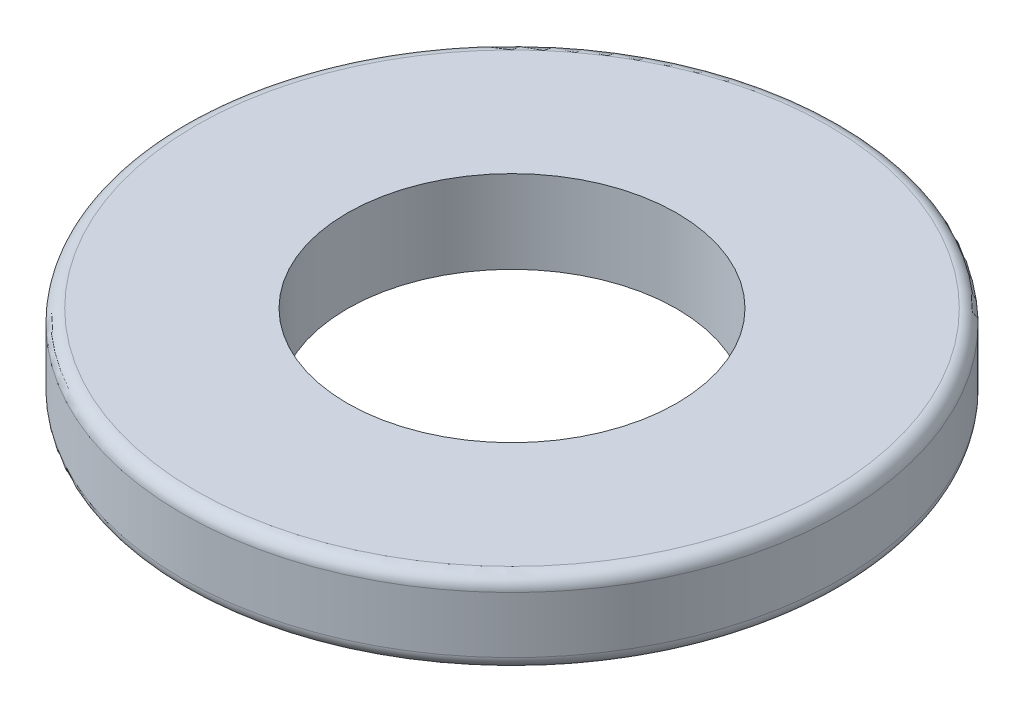
ISO-10303-21;
HEADER;
FILE_DESCRIPTION(('STEP AP214'),'2;1');
FILE_NAME('part.step','',(''),(''),'','','');
FILE_SCHEMA(('AUTOMOTIVE_DESIGN { 1 0 10303 214 1 1 1 1 }'));
ENDSEC;
DATA;
#1=APPLICATION_CONTEXT('core data for automotive mechanical design processes');
#2=APPLICATION_PROTOCOL_DEFINITION('international standard','automotive_design',2000,#1);
#3=PRODUCT_CONTEXT('',#1,'mechanical');
#4=PRODUCT('Part','Part','',(#3));
#5=PRODUCT_RELATED_PRODUCT_CATEGORY('part','',(#4));
#6=PRODUCT_DEFINITION_FORMATION('','',#4);
#7=PRODUCT_DEFINITION_CONTEXT('part definition',#1,'design');
#8=PRODUCT_DEFINITION('design','',#6,#7);
#9=PRODUCT_DEFINITION_SHAPE('','',#8);
#10=(LENGTH_UNIT() NAMED_UNIT(*) SI_UNIT(.MILLI.,.METRE.));
#11=(NAMED_UNIT(*) PLANE_ANGLE_UNIT() SI_UNIT($,.RADIAN.));
#12=(NAMED_UNIT(*) SI_UNIT($,.STERADIAN.) SOLID_ANGLE_UNIT());
#13=UNCERTAINTY_MEASURE_WITH_UNIT(LENGTH_MEASURE(1.E-05),#10,'distance_accuracy_value','');
#14=(GEOMETRIC_REPRESENTATION_CONTEXT(3) GLOBAL_UNCERTAINTY_ASSIGNED_CONTEXT((#13)) GLOBAL_UNIT_ASSIGNED_CONTEXT((#10,
#11,#12)) REPRESENTATION_CONTEXT('',''));
#15=CARTESIAN_POINT('',(0.,0.,0.));
#16=DIRECTION('',(0.,0.,1.));
#17=DIRECTION('',(1.,0.,0.));
#18=AXIS2_PLACEMENT_3D('',#15,#16,#17);
#19=CARTESIAN_POINT('',(0.,1.5875,0.));
#20=DIRECTION('',(0.,1.,0.));
#21=DIRECTION('',(0.,0.,1.));
#22=AXIS2_PLACEMENT_3D('',#19,#20,#21);
#23=PLANE('',#22);
#24=CARTESIAN_POINT('',(0.,1.5875,0.));
#25=DIRECTION('',(0.,1.,0.));
#26=DIRECTION('',(0.,0.,1.));
#27=AXIS2_PLACEMENT_3D('',#24,#25,#26);
#28=CIRCLE('',#27,6.0579);
#29=CARTESIAN_POINT('',(0.,1.5875,6.0579));
#30=VERTEX_POINT('',#29);
#31=EDGE_CURVE('E10',#30,#30,#28,.T.);
#32=ORIENTED_EDGE('',*,*,#31,.T.);
#33=EDGE_LOOP('',(#32));
#34=FACE_BOUND('',#33,.T.);
#35=CARTESIAN_POINT('',(0.,1.5875,0.));
#36=DIRECTION('',(0.,1.,0.));
#37=DIRECTION('',(0.,0.,1.));
#38=AXIS2_PLACEMENT_3D('',#35,#36,#37);
#39=CIRCLE('',#38,3.15595);
#40=CARTESIAN_POINT('',(0.,1.5875,3.15595));
#41=VERTEX_POINT('',#40);
#42=EDGE_CURVE('E61',#41,#41,#39,.T.);
#43=ORIENTED_EDGE('',*,*,#42,.F.);
#44=EDGE_LOOP('',(#43));
#45=FACE_BOUND('',#44,.T.);
#46=ADVANCED_FACE('F37',(#34,#45),#23,.T.);
#47=CARTESIAN_POINT('',(0.,0.,0.));
#48=DIRECTION('',(0.,1.,0.));
#49=DIRECTION('',(0.,0.,1.));
#50=AXIS2_PLACEMENT_3D('',#47,#48,#49);
#51=PLANE('',#50);
#52=CARTESIAN_POINT('',(0.,0.,0.));
#53=DIRECTION('',(0.,1.,0.));
#54=DIRECTION('',(0.,0.,1.));
#55=AXIS2_PLACEMENT_3D('',#52,#53,#54);
#56=CIRCLE('',#55,6.0579);
#57=CARTESIAN_POINT('',(0.,0.,6.0579));
#58=VERTEX_POINT('',#57);
#59=EDGE_CURVE('E45',#58,#58,#56,.F.);
#60=ORIENTED_EDGE('',*,*,#59,.T.);
#61=EDGE_LOOP('',(#60));
#62=FACE_BOUND('',#61,.T.);
#63=CARTESIAN_POINT('',(0.,0.,0.));
#64=DIRECTION('',(0.,1.,0.));
#65=DIRECTION('',(0.,0.,1.));
#66=AXIS2_PLACEMENT_3D('',#63,#64,#65);
#67=CIRCLE('',#66,3.15595);
#68=CARTESIAN_POINT('',(0.,0.,3.15595));
#69=VERTEX_POINT('',#68);
#70=EDGE_CURVE('E62',#69,#69,#67,.T.);
#71=ORIENTED_EDGE('',*,*,#70,.T.);
#72=EDGE_LOOP('',(#71));
#73=FACE_BOUND('',#72,.T.);
#74=ADVANCED_FACE('F74',(#62,#73),#51,.F.);
#75=CARTESIAN_POINT('',(0.,1.5875,0.));
#76=DIRECTION('',(0.,-1.,0.));
#77=DIRECTION('',(0.,0.,-1.));
#78=AXIS2_PLACEMENT_3D('',#75,#76,#77);
#79=CYLINDRICAL_SURFACE('',#78,6.3119);
#80=CARTESIAN_POINT('',(0.,0.254,0.));
#81=DIRECTION('',(0.,1.,0.));
#82=DIRECTION('',(0.,0.,1.));
#83=AXIS2_PLACEMENT_3D('',#80,#81,#82);
#84=CIRCLE('',#83,6.3119);
#85=CARTESIAN_POINT('',(0.,0.254,6.3119));
#86=VERTEX_POINT('',#85);
#87=EDGE_CURVE('E50',#86,#86,#84,.T.);
#88=ORIENTED_EDGE('',*,*,#87,.T.);
#89=EDGE_LOOP('',(#88));
#90=FACE_BOUND('',#89,.T.);
#91=CARTESIAN_POINT('',(0.,1.3335,0.));
#92=DIRECTION('',(0.,1.,0.));
#93=DIRECTION('',(0.,0.,1.));
#94=AXIS2_PLACEMENT_3D('',#91,#92,#93);
#95=CIRCLE('',#94,6.3119);
#96=CARTESIAN_POINT('',(0.,1.3335,6.3119));
#97=VERTEX_POINT('',#96);
#98=EDGE_CURVE('E55',#97,#97,#95,.F.);
#99=ORIENTED_EDGE('',*,*,#98,.T.);
#100=EDGE_LOOP('',(#99));
#101=FACE_BOUND('',#100,.T.);
#102=ADVANCED_FACE('F79',(#90,#101),#79,.T.);
#103=CARTESIAN_POINT('',(0.,1.5875,0.));
#104=DIRECTION('',(0.,-1.,0.));
#105=DIRECTION('',(0.,0.,-1.));
#106=AXIS2_PLACEMENT_3D('',#103,#104,#105);
#107=CYLINDRICAL_SURFACE('',#106,3.15595);
#108=ORIENTED_EDGE('',*,*,#42,.T.);
#109=EDGE_LOOP('',(#108));
#110=FACE_BOUND('',#109,.T.);
#111=ORIENTED_EDGE('',*,*,#70,.F.);
#112=EDGE_LOOP('',(#111));
#113=FACE_BOUND('',#112,.T.);
#114=ADVANCED_FACE('F70',(#110,#113),#107,.F.);
#115=CARTESIAN_POINT('',(0.,0.254,0.));
#116=DIRECTION('',(0.,1.,0.));
#117=DIRECTION('',(0.,0.,1.));
#118=AXIS2_PLACEMENT_3D('',#115,#116,#117);
#119=TOROIDAL_SURFACE('',#118,6.0579,0.254);
#120=ORIENTED_EDGE('',*,*,#59,.F.);
#121=EDGE_LOOP('',(#120));
#122=FACE_BOUND('',#121,.T.);
#123=ORIENTED_EDGE('',*,*,#87,.F.);
#124=EDGE_LOOP('',(#123));
#125=FACE_BOUND('',#124,.T.);
#126=ADVANCED_FACE('F85',(#122,#125),#119,.T.);
#127=CARTESIAN_POINT('',(0.,1.3335,0.));
#128=DIRECTION('',(0.,1.,0.));
#129=DIRECTION('',(0.,0.,1.));
#130=AXIS2_PLACEMENT_3D('',#127,#128,#129);
#131=TOROIDAL_SURFACE('',#130,6.0579,0.254);
#132=ORIENTED_EDGE('',*,*,#98,.F.);
#133=EDGE_LOOP('',(#132));
#134=FACE_BOUND('',#133,.T.);
#135=ORIENTED_EDGE('',*,*,#31,.F.);
#136=EDGE_LOOP('',(#135));
#137=FACE_BOUND('',#136,.T.);
#138=ADVANCED_FACE('F39',(#134,#137),#131,.T.);
#139=CLOSED_SHELL('',(#46,#74,#102,#114,#126,#138));
#140=MANIFOLD_SOLID_BREP('B2',#139);
#141=ADVANCED_BREP_SHAPE_REPRESENTATION('',(#18,#140),#14);
#142=SHAPE_DEFINITION_REPRESENTATION(#9,#141);
ENDSEC;
END-ISO-10303-21;
